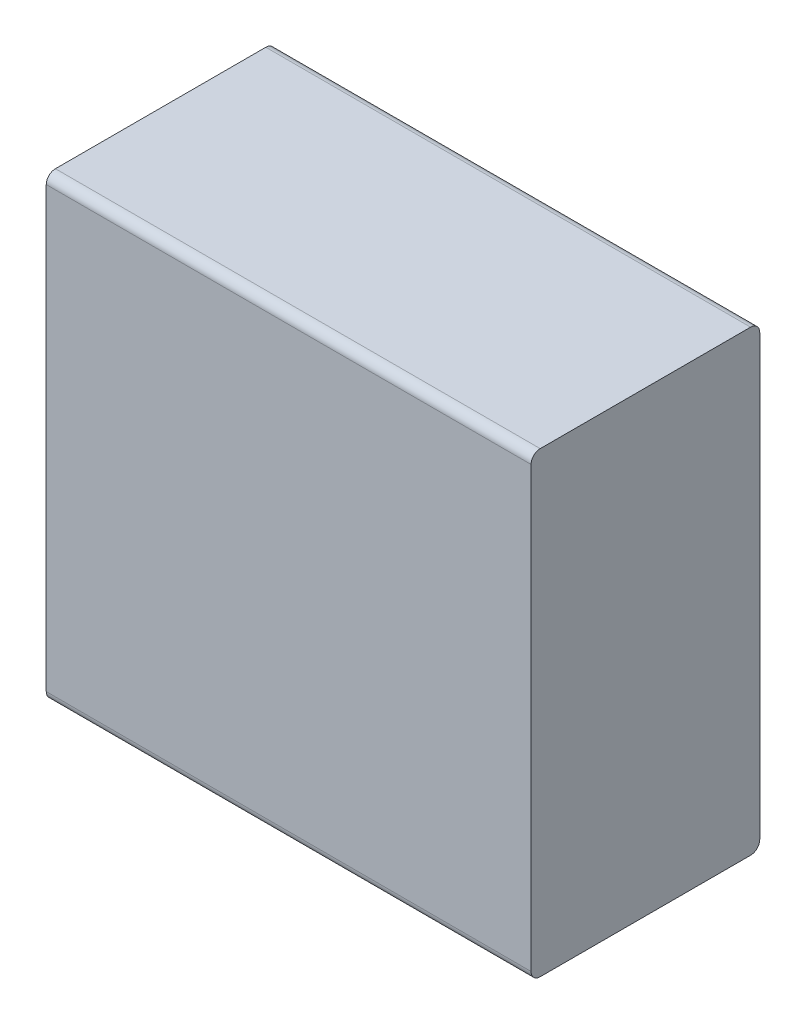
ISO-10303-21;
HEADER;
FILE_DESCRIPTION(('STEP AP214'),'2;1');
FILE_NAME('part.step','',(''),(''),'','','');
FILE_SCHEMA(('AUTOMOTIVE_DESIGN { 1 0 10303 214 1 1 1 1 }'));
ENDSEC;
DATA;
#1=APPLICATION_CONTEXT('core data for automotive mechanical design processes');
#2=APPLICATION_PROTOCOL_DEFINITION('international standard','automotive_design',2000,#1);
#3=PRODUCT_CONTEXT('',#1,'mechanical');
#4=PRODUCT('Part','Part','',(#3));
#5=PRODUCT_RELATED_PRODUCT_CATEGORY('part','',(#4));
#6=PRODUCT_DEFINITION_FORMATION('','',#4);
#7=PRODUCT_DEFINITION_CONTEXT('part definition',#1,'design');
#8=PRODUCT_DEFINITION('design','',#6,#7);
#9=PRODUCT_DEFINITION_SHAPE('','',#8);
#10=(LENGTH_UNIT() NAMED_UNIT(*) SI_UNIT(.MILLI.,.METRE.));
#11=(NAMED_UNIT(*) PLANE_ANGLE_UNIT() SI_UNIT($,.RADIAN.));
#12=(NAMED_UNIT(*) SI_UNIT($,.STERADIAN.) SOLID_ANGLE_UNIT());
#13=UNCERTAINTY_MEASURE_WITH_UNIT(LENGTH_MEASURE(1.E-05),#10,'distance_accuracy_value','');
#14=(GEOMETRIC_REPRESENTATION_CONTEXT(3) GLOBAL_UNCERTAINTY_ASSIGNED_CONTEXT((#13)) GLOBAL_UNIT_ASSIGNED_CONTEXT((#10,
#11,#12)) REPRESENTATION_CONTEXT('',''));
#15=CARTESIAN_POINT('',(0.,0.,0.));
#16=DIRECTION('',(0.,0.,1.));
#17=DIRECTION('',(1.,0.,0.));
#18=AXIS2_PLACEMENT_3D('',#15,#16,#17);
#19=CARTESIAN_POINT('',(2.65,0.,1.25));
#20=DIRECTION('',(1.,0.,0.));
#21=DIRECTION('',(0.,0.,-1.));
#22=AXIS2_PLACEMENT_3D('',#19,#20,#21);
#23=PLANE('',#22);
#24=DIRECTION('',(0.,1.,0.));
#25=VECTOR('',#24,1.);
#26=CARTESIAN_POINT('',(2.65,-2.4,0.));
#27=LINE('',#26,#25);
#28=CARTESIAN_POINT('',(2.65,-2.4,0.));
#29=VERTEX_POINT('',#28);
#30=CARTESIAN_POINT('',(2.65,2.4,0.));
#31=VERTEX_POINT('',#30);
#32=EDGE_CURVE('E11',#29,#31,#27,.T.);
#33=ORIENTED_EDGE('',*,*,#32,.T.);
#34=CARTESIAN_POINT('',(2.65,2.4,0.1));
#35=DIRECTION('',(1.,0.,0.));
#36=DIRECTION('',(0.,0.,-1.));
#37=AXIS2_PLACEMENT_3D('',#34,#35,#36);
#38=CIRCLE('',#37,0.1);
#39=CARTESIAN_POINT('',(2.65,2.5,0.1));
#40=VERTEX_POINT('',#39);
#41=EDGE_CURVE('E24',#31,#40,#38,.T.);
#42=ORIENTED_EDGE('',*,*,#41,.T.);
#43=DIRECTION('',(0.,0.,1.));
#44=VECTOR('',#43,1.);
#45=CARTESIAN_POINT('',(2.65,2.5,0.1));
#46=LINE('',#45,#44);
#47=CARTESIAN_POINT('',(2.65,2.5,2.4));
#48=VERTEX_POINT('',#47);
#49=EDGE_CURVE('E141',#40,#48,#46,.T.);
#50=ORIENTED_EDGE('',*,*,#49,.T.);
#51=CARTESIAN_POINT('',(2.65,2.4,2.4));
#52=DIRECTION('',(1.,0.,0.));
#53=DIRECTION('',(0.,1.,0.));
#54=AXIS2_PLACEMENT_3D('',#51,#52,#53);
#55=CIRCLE('',#54,0.1);
#56=CARTESIAN_POINT('',(2.65,2.4,2.5));
#57=VERTEX_POINT('',#56);
#58=EDGE_CURVE('E139',#48,#57,#55,.T.);
#59=ORIENTED_EDGE('',*,*,#58,.T.);
#60=DIRECTION('',(0.,-1.,0.));
#61=VECTOR('',#60,1.);
#62=CARTESIAN_POINT('',(2.65,2.4,2.5));
#63=LINE('',#62,#61);
#64=CARTESIAN_POINT('',(2.65,-2.4,2.5));
#65=VERTEX_POINT('',#64);
#66=EDGE_CURVE('E137',#57,#65,#63,.T.);
#67=ORIENTED_EDGE('',*,*,#66,.T.);
#68=CARTESIAN_POINT('',(2.65,-2.4,2.4));
#69=DIRECTION('',(1.,0.,0.));
#70=DIRECTION('',(0.,0.,1.));
#71=AXIS2_PLACEMENT_3D('',#68,#69,#70);
#72=CIRCLE('',#71,0.1);
#73=CARTESIAN_POINT('',(2.65,-2.5,2.4));
#74=VERTEX_POINT('',#73);
#75=EDGE_CURVE('E135',#65,#74,#72,.T.);
#76=ORIENTED_EDGE('',*,*,#75,.T.);
#77=DIRECTION('',(0.,0.,-1.));
#78=VECTOR('',#77,1.);
#79=CARTESIAN_POINT('',(2.65,-2.5,2.4));
#80=LINE('',#79,#78);
#81=CARTESIAN_POINT('',(2.65,-2.5,0.1));
#82=VERTEX_POINT('',#81);
#83=EDGE_CURVE('E133',#74,#82,#80,.T.);
#84=ORIENTED_EDGE('',*,*,#83,.T.);
#85=CARTESIAN_POINT('',(2.65,-2.4,0.1));
#86=DIRECTION('',(1.,0.,0.));
#87=DIRECTION('',(0.,-1.,0.));
#88=AXIS2_PLACEMENT_3D('',#85,#86,#87);
#89=CIRCLE('',#88,0.1);
#90=EDGE_CURVE('E131',#82,#29,#89,.T.);
#91=ORIENTED_EDGE('',*,*,#90,.T.);
#92=EDGE_LOOP('',(#33,#42,#50,#59,#67,#76,#84,#91));
#93=FACE_BOUND('',#92,.T.);
#94=ADVANCED_FACE('F17',(#93),#23,.T.);
#95=CARTESIAN_POINT('',(0.,2.4,0.1));
#96=DIRECTION('',(-1.,0.,0.));
#97=DIRECTION('',(0.,0.,-1.));
#98=AXIS2_PLACEMENT_3D('',#95,#96,#97);
#99=CYLINDRICAL_SURFACE('',#98,0.1);
#100=DIRECTION('',(1.,0.,0.));
#101=VECTOR('',#100,1.);
#102=CARTESIAN_POINT('',(0.,2.4,0.));
#103=LINE('',#102,#101);
#104=CARTESIAN_POINT('',(-2.65,2.4,0.));
#105=VERTEX_POINT('',#104);
#106=EDGE_CURVE('E129',#105,#31,#103,.T.);
#107=ORIENTED_EDGE('',*,*,#106,.F.);
#108=CARTESIAN_POINT('',(-2.65,2.4,0.1));
#109=DIRECTION('',(-1.,0.,0.));
#110=DIRECTION('',(0.,0.,-1.));
#111=AXIS2_PLACEMENT_3D('',#108,#109,#110);
#112=CIRCLE('',#111,0.1);
#113=CARTESIAN_POINT('',(-2.65,2.5,0.1));
#114=VERTEX_POINT('',#113);
#115=EDGE_CURVE('E96',#114,#105,#112,.T.);
#116=ORIENTED_EDGE('',*,*,#115,.F.);
#117=DIRECTION('',(1.,0.,0.));
#118=VECTOR('',#117,1.);
#119=CARTESIAN_POINT('',(0.,2.5,0.1));
#120=LINE('',#119,#118);
#121=EDGE_CURVE('E125',#114,#40,#120,.T.);
#122=ORIENTED_EDGE('',*,*,#121,.T.);
#123=ORIENTED_EDGE('',*,*,#41,.F.);
#124=EDGE_LOOP('',(#107,#116,#122,#123));
#125=FACE_BOUND('',#124,.T.);
#126=ADVANCED_FACE('F149',(#125),#99,.T.);
#127=CARTESIAN_POINT('',(0.,2.5,2.4));
#128=DIRECTION('',(0.,1.,0.));
#129=DIRECTION('',(0.,0.,-1.));
#130=AXIS2_PLACEMENT_3D('',#127,#128,#129);
#131=PLANE('',#130);
#132=ORIENTED_EDGE('',*,*,#121,.F.);
#133=DIRECTION('',(0.,0.,-1.));
#134=VECTOR('',#133,1.);
#135=CARTESIAN_POINT('',(-2.65,2.5,0.1));
#136=LINE('',#135,#134);
#137=CARTESIAN_POINT('',(-2.65,2.5,2.4));
#138=VERTEX_POINT('',#137);
#139=EDGE_CURVE('E123',#138,#114,#136,.T.);
#140=ORIENTED_EDGE('',*,*,#139,.F.);
#141=DIRECTION('',(1.,0.,0.));
#142=VECTOR('',#141,1.);
#143=CARTESIAN_POINT('',(0.,2.5,2.4));
#144=LINE('',#143,#142);
#145=EDGE_CURVE('E120',#138,#48,#144,.T.);
#146=ORIENTED_EDGE('',*,*,#145,.T.);
#147=ORIENTED_EDGE('',*,*,#49,.F.);
#148=EDGE_LOOP('',(#132,#140,#146,#147));
#149=FACE_BOUND('',#148,.T.);
#150=ADVANCED_FACE('F147',(#149),#131,.T.);
#151=CARTESIAN_POINT('',(0.,2.4,2.4));
#152=DIRECTION('',(-1.,0.,0.));
#153=DIRECTION('',(0.,1.,0.));
#154=AXIS2_PLACEMENT_3D('',#151,#152,#153);
#155=CYLINDRICAL_SURFACE('',#154,0.1);
#156=ORIENTED_EDGE('',*,*,#145,.F.);
#157=CARTESIAN_POINT('',(-2.65,2.4,2.4));
#158=DIRECTION('',(-1.,0.,0.));
#159=DIRECTION('',(0.,1.,0.));
#160=AXIS2_PLACEMENT_3D('',#157,#158,#159);
#161=CIRCLE('',#160,0.1);
#162=CARTESIAN_POINT('',(-2.65,2.4,2.5));
#163=VERTEX_POINT('',#162);
#164=EDGE_CURVE('E117',#163,#138,#161,.T.);
#165=ORIENTED_EDGE('',*,*,#164,.F.);
#166=DIRECTION('',(1.,0.,0.));
#167=VECTOR('',#166,1.);
#168=CARTESIAN_POINT('',(0.,2.4,2.5));
#169=LINE('',#168,#167);
#170=EDGE_CURVE('E114',#163,#57,#169,.T.);
#171=ORIENTED_EDGE('',*,*,#170,.T.);
#172=ORIENTED_EDGE('',*,*,#58,.F.);
#173=EDGE_LOOP('',(#156,#165,#171,#172));
#174=FACE_BOUND('',#173,.T.);
#175=ADVANCED_FACE('F156',(#174),#155,.T.);
#176=CARTESIAN_POINT('',(0.,-2.4,2.5));
#177=DIRECTION('',(0.,0.,1.));
#178=DIRECTION('',(0.,1.,0.));
#179=AXIS2_PLACEMENT_3D('',#176,#177,#178);
#180=PLANE('',#179);
#181=ORIENTED_EDGE('',*,*,#170,.F.);
#182=DIRECTION('',(0.,1.,0.));
#183=VECTOR('',#182,1.);
#184=CARTESIAN_POINT('',(-2.65,2.4,2.5));
#185=LINE('',#184,#183);
#186=CARTESIAN_POINT('',(-2.65,-2.4,2.5));
#187=VERTEX_POINT('',#186);
#188=EDGE_CURVE('E111',#187,#163,#185,.T.);
#189=ORIENTED_EDGE('',*,*,#188,.F.);
#190=DIRECTION('',(1.,0.,0.));
#191=VECTOR('',#190,1.);
#192=CARTESIAN_POINT('',(0.,-2.4,2.5));
#193=LINE('',#192,#191);
#194=EDGE_CURVE('E108',#187,#65,#193,.T.);
#195=ORIENTED_EDGE('',*,*,#194,.T.);
#196=ORIENTED_EDGE('',*,*,#66,.F.);
#197=EDGE_LOOP('',(#181,#189,#195,#196));
#198=FACE_BOUND('',#197,.T.);
#199=ADVANCED_FACE('F161',(#198),#180,.T.);
#200=CARTESIAN_POINT('',(0.,-2.4,2.4));
#201=DIRECTION('',(-1.,0.,0.));
#202=DIRECTION('',(0.,0.,1.));
#203=AXIS2_PLACEMENT_3D('',#200,#201,#202);
#204=CYLINDRICAL_SURFACE('',#203,0.1);
#205=ORIENTED_EDGE('',*,*,#194,.F.);
#206=CARTESIAN_POINT('',(-2.65,-2.4,2.4));
#207=DIRECTION('',(-1.,0.,0.));
#208=DIRECTION('',(0.,0.,1.));
#209=AXIS2_PLACEMENT_3D('',#206,#207,#208);
#210=CIRCLE('',#209,0.1);
#211=CARTESIAN_POINT('',(-2.65,-2.5,2.4));
#212=VERTEX_POINT('',#211);
#213=EDGE_CURVE('E105',#212,#187,#210,.T.);
#214=ORIENTED_EDGE('',*,*,#213,.F.);
#215=DIRECTION('',(1.,0.,0.));
#216=VECTOR('',#215,1.);
#217=CARTESIAN_POINT('',(0.,-2.5,2.4));
#218=LINE('',#217,#216);
#219=EDGE_CURVE('E102',#212,#74,#218,.T.);
#220=ORIENTED_EDGE('',*,*,#219,.T.);
#221=ORIENTED_EDGE('',*,*,#75,.F.);
#222=EDGE_LOOP('',(#205,#214,#220,#221));
#223=FACE_BOUND('',#222,.T.);
#224=ADVANCED_FACE('F165',(#223),#204,.T.);
#225=CARTESIAN_POINT('',(0.,-2.5,0.1));
#226=DIRECTION('',(0.,-1.,0.));
#227=DIRECTION('',(0.,0.,1.));
#228=AXIS2_PLACEMENT_3D('',#225,#226,#227);
#229=PLANE('',#228);
#230=ORIENTED_EDGE('',*,*,#219,.F.);
#231=DIRECTION('',(0.,0.,1.));
#232=VECTOR('',#231,1.);
#233=CARTESIAN_POINT('',(-2.65,-2.5,2.4));
#234=LINE('',#233,#232);
#235=CARTESIAN_POINT('',(-2.65,-2.5,0.1));
#236=VERTEX_POINT('',#235);
#237=EDGE_CURVE('E100',#236,#212,#234,.T.);
#238=ORIENTED_EDGE('',*,*,#237,.F.);
#239=DIRECTION('',(1.,0.,0.));
#240=VECTOR('',#239,1.);
#241=CARTESIAN_POINT('',(0.,-2.5,0.1));
#242=LINE('',#241,#240);
#243=EDGE_CURVE('E84',#236,#82,#242,.T.);
#244=ORIENTED_EDGE('',*,*,#243,.T.);
#245=ORIENTED_EDGE('',*,*,#83,.F.);
#246=EDGE_LOOP('',(#230,#238,#244,#245));
#247=FACE_BOUND('',#246,.T.);
#248=ADVANCED_FACE('F169',(#247),#229,.T.);
#249=CARTESIAN_POINT('',(0.,-2.4,0.1));
#250=DIRECTION('',(-1.,0.,0.));
#251=DIRECTION('',(0.,-1.,0.));
#252=AXIS2_PLACEMENT_3D('',#249,#250,#251);
#253=CYLINDRICAL_SURFACE('',#252,0.1);
#254=ORIENTED_EDGE('',*,*,#243,.F.);
#255=CARTESIAN_POINT('',(-2.65,-2.4,0.1));
#256=DIRECTION('',(-1.,0.,0.));
#257=DIRECTION('',(0.,-1.,0.));
#258=AXIS2_PLACEMENT_3D('',#255,#256,#257);
#259=CIRCLE('',#258,0.1);
#260=CARTESIAN_POINT('',(-2.65,-2.4,0.));
#261=VERTEX_POINT('',#260);
#262=EDGE_CURVE('E79',#261,#236,#259,.T.);
#263=ORIENTED_EDGE('',*,*,#262,.F.);
#264=DIRECTION('',(-1.,0.,0.));
#265=VECTOR('',#264,1.);
#266=CARTESIAN_POINT('',(0.,-2.4,0.));
#267=LINE('',#266,#265);
#268=EDGE_CURVE('E82',#29,#261,#267,.T.);
#269=ORIENTED_EDGE('',*,*,#268,.F.);
#270=ORIENTED_EDGE('',*,*,#90,.F.);
#271=EDGE_LOOP('',(#254,#263,#269,#270));
#272=FACE_BOUND('',#271,.T.);
#273=ADVANCED_FACE('F80',(#272),#253,.T.);
#274=CARTESIAN_POINT('',(0.,2.4,0.));
#275=DIRECTION('',(0.,0.,-1.));
#276=DIRECTION('',(0.,-1.,0.));
#277=AXIS2_PLACEMENT_3D('',#274,#275,#276);
#278=PLANE('',#277);
#279=ORIENTED_EDGE('',*,*,#268,.T.);
#280=DIRECTION('',(0.,-1.,0.));
#281=VECTOR('',#280,1.);
#282=CARTESIAN_POINT('',(-2.65,-2.4,0.));
#283=LINE('',#282,#281);
#284=EDGE_CURVE('E91',#105,#261,#283,.T.);
#285=ORIENTED_EDGE('',*,*,#284,.F.);
#286=ORIENTED_EDGE('',*,*,#106,.T.);
#287=ORIENTED_EDGE('',*,*,#32,.F.);
#288=EDGE_LOOP('',(#279,#285,#286,#287));
#289=FACE_BOUND('',#288,.T.);
#290=ADVANCED_FACE('F90',(#289),#278,.T.);
#291=CARTESIAN_POINT('',(-2.65,0.,1.25));
#292=DIRECTION('',(1.,0.,0.));
#293=DIRECTION('',(0.,0.,-1.));
#294=AXIS2_PLACEMENT_3D('',#291,#292,#293);
#295=PLANE('',#294);
#296=ORIENTED_EDGE('',*,*,#284,.T.);
#297=ORIENTED_EDGE('',*,*,#262,.T.);
#298=ORIENTED_EDGE('',*,*,#237,.T.);
#299=ORIENTED_EDGE('',*,*,#213,.T.);
#300=ORIENTED_EDGE('',*,*,#188,.T.);
#301=ORIENTED_EDGE('',*,*,#164,.T.);
#302=ORIENTED_EDGE('',*,*,#139,.T.);
#303=ORIENTED_EDGE('',*,*,#115,.T.);
#304=EDGE_LOOP('',(#296,#297,#298,#299,#300,#301,#302,#303));
#305=FACE_BOUND('',#304,.T.);
#306=ADVANCED_FACE('F94',(#305),#295,.F.);
#307=CLOSED_SHELL('',(#94,#126,#150,#175,#199,#224,#248,#273,#290,#306));
#308=MANIFOLD_SOLID_BREP('B1',#307);
#309=ADVANCED_BREP_SHAPE_REPRESENTATION('',(#18,#308),#14);
#310=SHAPE_DEFINITION_REPRESENTATION(#9,#309);
ENDSEC;
END-ISO-10303-21;
